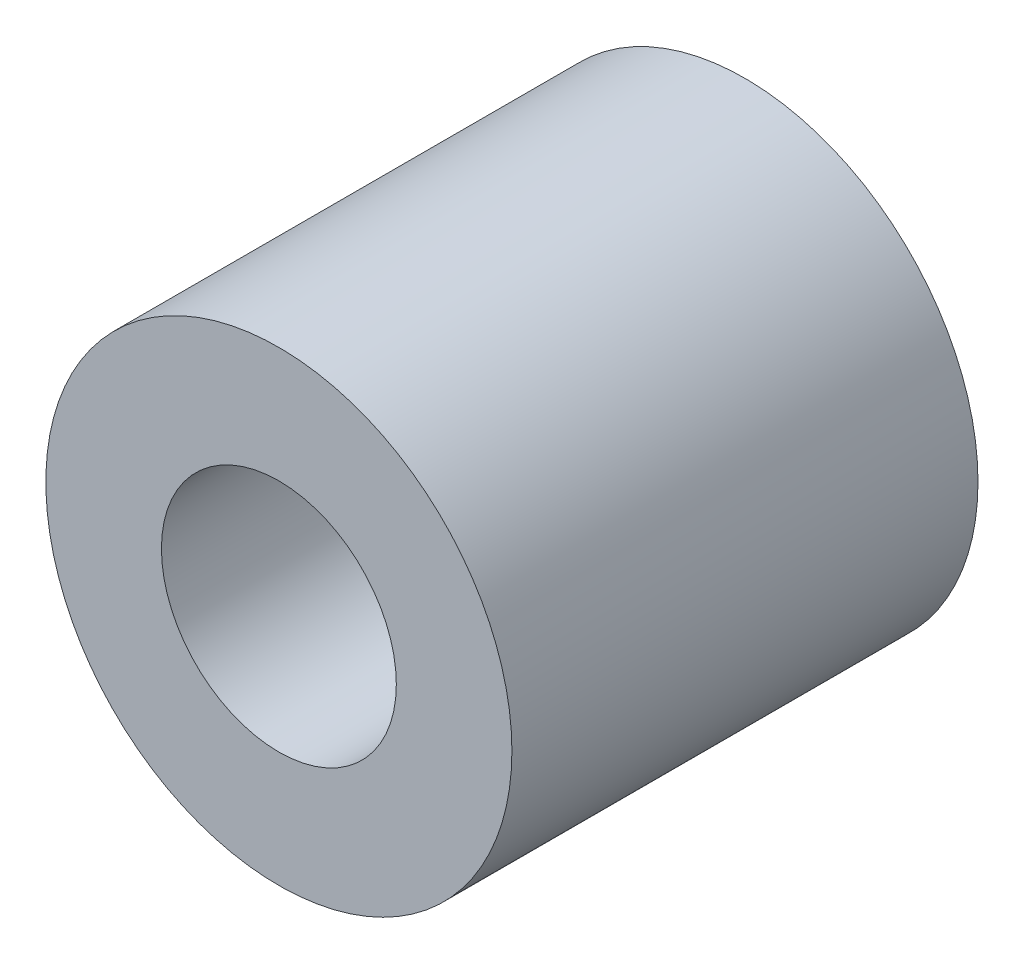
ISO-10303-21;
HEADER;
FILE_DESCRIPTION(('STEP AP214'),'2;1');
FILE_NAME('part.step','',(''),(''),'','','');
FILE_SCHEMA(('AUTOMOTIVE_DESIGN { 1 0 10303 214 1 1 1 1 }'));
ENDSEC;
DATA;
#1=APPLICATION_CONTEXT('core data for automotive mechanical design processes');
#2=APPLICATION_PROTOCOL_DEFINITION('international standard','automotive_design',2000,#1);
#3=PRODUCT_CONTEXT('',#1,'mechanical');
#4=PRODUCT('Part','Part','',(#3));
#5=PRODUCT_RELATED_PRODUCT_CATEGORY('part','',(#4));
#6=PRODUCT_DEFINITION_FORMATION('','',#4);
#7=PRODUCT_DEFINITION_CONTEXT('part definition',#1,'design');
#8=PRODUCT_DEFINITION('design','',#6,#7);
#9=PRODUCT_DEFINITION_SHAPE('','',#8);
#10=(LENGTH_UNIT() NAMED_UNIT(*) SI_UNIT(.MILLI.,.METRE.));
#11=(NAMED_UNIT(*) PLANE_ANGLE_UNIT() SI_UNIT($,.RADIAN.));
#12=(NAMED_UNIT(*) SI_UNIT($,.STERADIAN.) SOLID_ANGLE_UNIT());
#13=UNCERTAINTY_MEASURE_WITH_UNIT(LENGTH_MEASURE(1.E-05),#10,'distance_accuracy_value','');
#14=(GEOMETRIC_REPRESENTATION_CONTEXT(3) GLOBAL_UNCERTAINTY_ASSIGNED_CONTEXT((#13)) GLOBAL_UNIT_ASSIGNED_CONTEXT((#10,
#11,#12)) REPRESENTATION_CONTEXT('',''));
#15=CARTESIAN_POINT('',(0.,0.,0.));
#16=DIRECTION('',(0.,0.,1.));
#17=DIRECTION('',(1.,0.,0.));
#18=AXIS2_PLACEMENT_3D('',#15,#16,#17);
#19=CARTESIAN_POINT('',(0.,0.,6.35));
#20=DIRECTION('',(0.,0.,1.));
#21=DIRECTION('',(1.,0.,0.));
#22=AXIS2_PLACEMENT_3D('',#19,#20,#21);
#23=PLANE('',#22);
#24=CARTESIAN_POINT('',(0.,0.,6.35));
#25=DIRECTION('',(0.,0.,1.));
#26=DIRECTION('',(1.,0.,0.));
#27=AXIS2_PLACEMENT_3D('',#24,#25,#26);
#28=CIRCLE('',#27,6.35);
#29=CARTESIAN_POINT('',(6.35,0.,6.35));
#30=VERTEX_POINT('',#29);
#31=EDGE_CURVE('E10',#30,#30,#28,.T.);
#32=ORIENTED_EDGE('',*,*,#31,.T.);
#33=EDGE_LOOP('',(#32));
#34=FACE_BOUND('',#33,.T.);
#35=CARTESIAN_POINT('',(0.,0.,6.35));
#36=DIRECTION('',(0.,0.,1.));
#37=DIRECTION('',(1.,0.,0.));
#38=AXIS2_PLACEMENT_3D('',#35,#36,#37);
#39=CIRCLE('',#38,3.2004);
#40=CARTESIAN_POINT('',(3.2004,0.,6.35));
#41=VERTEX_POINT('',#40);
#42=EDGE_CURVE('E41',#41,#41,#39,.T.);
#43=ORIENTED_EDGE('',*,*,#42,.F.);
#44=EDGE_LOOP('',(#43));
#45=FACE_BOUND('',#44,.T.);
#46=ADVANCED_FACE('F30',(#34,#45),#23,.T.);
#47=CARTESIAN_POINT('',(0.,0.,-6.35));
#48=DIRECTION('',(0.,0.,1.));
#49=DIRECTION('',(1.,0.,0.));
#50=AXIS2_PLACEMENT_3D('',#47,#48,#49);
#51=PLANE('',#50);
#52=CARTESIAN_POINT('',(0.,0.,-6.35));
#53=DIRECTION('',(0.,0.,1.));
#54=DIRECTION('',(1.,0.,0.));
#55=AXIS2_PLACEMENT_3D('',#52,#53,#54);
#56=CIRCLE('',#55,6.35);
#57=CARTESIAN_POINT('',(6.35,0.,-6.35));
#58=VERTEX_POINT('',#57);
#59=EDGE_CURVE('E34',#58,#58,#56,.T.);
#60=ORIENTED_EDGE('',*,*,#59,.F.);
#61=EDGE_LOOP('',(#60));
#62=FACE_BOUND('',#61,.T.);
#63=CARTESIAN_POINT('',(0.,0.,-6.35));
#64=DIRECTION('',(0.,0.,1.));
#65=DIRECTION('',(1.,0.,0.));
#66=AXIS2_PLACEMENT_3D('',#63,#64,#65);
#67=CIRCLE('',#66,3.2004);
#68=CARTESIAN_POINT('',(3.2004,0.,-6.35));
#69=VERTEX_POINT('',#68);
#70=EDGE_CURVE('E43',#69,#69,#67,.T.);
#71=ORIENTED_EDGE('',*,*,#70,.T.);
#72=EDGE_LOOP('',(#71));
#73=FACE_BOUND('',#72,.T.);
#74=ADVANCED_FACE('F53',(#62,#73),#51,.F.);
#75=CARTESIAN_POINT('',(0.,0.,6.35));
#76=DIRECTION('',(0.,0.,-1.));
#77=DIRECTION('',(-1.,0.,0.));
#78=AXIS2_PLACEMENT_3D('',#75,#76,#77);
#79=CYLINDRICAL_SURFACE('',#78,6.35);
#80=ORIENTED_EDGE('',*,*,#31,.F.);
#81=EDGE_LOOP('',(#80));
#82=FACE_BOUND('',#81,.T.);
#83=ORIENTED_EDGE('',*,*,#59,.T.);
#84=EDGE_LOOP('',(#83));
#85=FACE_BOUND('',#84,.T.);
#86=ADVANCED_FACE('F32',(#82,#85),#79,.T.);
#87=CARTESIAN_POINT('',(0.,0.,6.35));
#88=DIRECTION('',(0.,0.,-1.));
#89=DIRECTION('',(-1.,0.,0.));
#90=AXIS2_PLACEMENT_3D('',#87,#88,#89);
#91=CYLINDRICAL_SURFACE('',#90,3.2004);
#92=ORIENTED_EDGE('',*,*,#42,.T.);
#93=EDGE_LOOP('',(#92));
#94=FACE_BOUND('',#93,.T.);
#95=ORIENTED_EDGE('',*,*,#70,.F.);
#96=EDGE_LOOP('',(#95));
#97=FACE_BOUND('',#96,.T.);
#98=ADVANCED_FACE('F49',(#94,#97),#91,.F.);
#99=CLOSED_SHELL('',(#46,#74,#86,#98));
#100=MANIFOLD_SOLID_BREP('B2',#99);
#101=ADVANCED_BREP_SHAPE_REPRESENTATION('',(#18,#100),#14);
#102=SHAPE_DEFINITION_REPRESENTATION(#9,#101);
ENDSEC;
END-ISO-10303-21;
